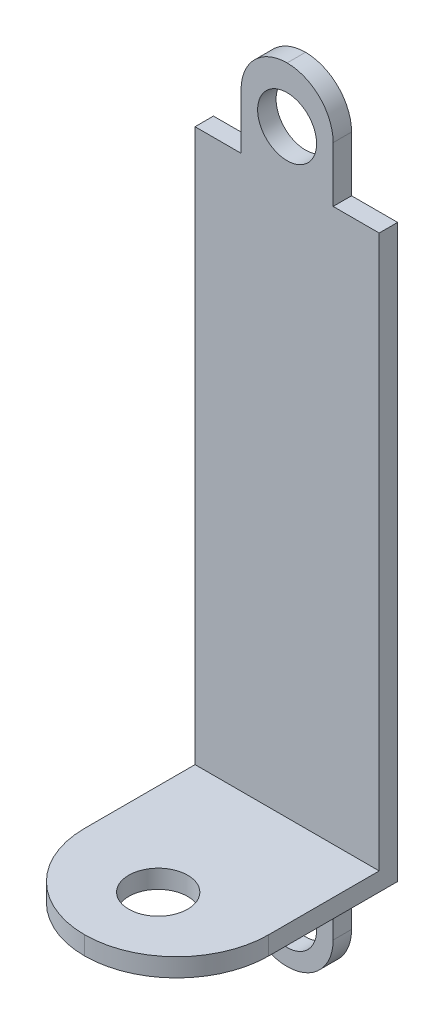
ISO-10303-21;
HEADER;
FILE_DESCRIPTION(('STEP AP214'),'2;1');
FILE_NAME('part.step','',(''),(''),'','','');
FILE_SCHEMA(('AUTOMOTIVE_DESIGN { 1 0 10303 214 1 1 1 1 }'));
ENDSEC;
DATA;
#1=APPLICATION_CONTEXT('core data for automotive mechanical design processes');
#2=APPLICATION_PROTOCOL_DEFINITION('international standard','automotive_design',2000,#1);
#3=PRODUCT_CONTEXT('',#1,'mechanical');
#4=PRODUCT('Part','Part','',(#3));
#5=PRODUCT_RELATED_PRODUCT_CATEGORY('part','',(#4));
#6=PRODUCT_DEFINITION_FORMATION('','',#4);
#7=PRODUCT_DEFINITION_CONTEXT('part definition',#1,'design');
#8=PRODUCT_DEFINITION('design','',#6,#7);
#9=PRODUCT_DEFINITION_SHAPE('','',#8);
#10=(LENGTH_UNIT() NAMED_UNIT(*) SI_UNIT(.MILLI.,.METRE.));
#11=(NAMED_UNIT(*) PLANE_ANGLE_UNIT() SI_UNIT($,.RADIAN.));
#12=(NAMED_UNIT(*) SI_UNIT($,.STERADIAN.) SOLID_ANGLE_UNIT());
#13=UNCERTAINTY_MEASURE_WITH_UNIT(LENGTH_MEASURE(1.E-05),#10,'distance_accuracy_value','');
#14=(GEOMETRIC_REPRESENTATION_CONTEXT(3) GLOBAL_UNCERTAINTY_ASSIGNED_CONTEXT((#13)) GLOBAL_UNIT_ASSIGNED_CONTEXT((#10,
#11,#12)) REPRESENTATION_CONTEXT('',''));
#15=CARTESIAN_POINT('',(0.,0.,0.));
#16=DIRECTION('',(0.,0.,1.));
#17=DIRECTION('',(1.,0.,0.));
#18=AXIS2_PLACEMENT_3D('',#15,#16,#17);
#19=CARTESIAN_POINT('',(-18.1571957093631,-29.8899270072993,12.));
#20=DIRECTION('',(0.,1.,0.));
#21=DIRECTION('',(0.,0.,1.));
#22=AXIS2_PLACEMENT_3D('',#19,#20,#21);
#23=PLANE('',#22);
#24=CARTESIAN_POINT('',(-13.1571957093631,-29.8899270072993,8.));
#25=DIRECTION('',(0.,1.,0.));
#26=DIRECTION('',(0.,0.,1.));
#27=AXIS2_PLACEMENT_3D('',#24,#25,#26);
#28=CIRCLE('',#27,1.6);
#29=CARTESIAN_POINT('',(-13.1571957093631,-29.8899270072993,9.6));
#30=VERTEX_POINT('',#29);
#31=EDGE_CURVE('E284',#30,#30,#28,.T.);
#32=ORIENTED_EDGE('',*,*,#31,.T.);
#33=EDGE_LOOP('',(#32));
#34=FACE_BOUND('',#33,.T.);
#35=DIRECTION('',(0.,0.,1.));
#36=VECTOR('',#35,1.);
#37=CARTESIAN_POINT('',(-10.6571957093631,-29.8899270072993,1.));
#38=LINE('',#37,#36);
#39=CARTESIAN_POINT('',(-10.6571957093631,-29.8899270072993,0.));
#40=VERTEX_POINT('',#39);
#41=CARTESIAN_POINT('',(-10.6571957093631,-29.8899270072993,1.));
#42=VERTEX_POINT('',#41);
#43=EDGE_CURVE('E228',#40,#42,#38,.T.);
#44=ORIENTED_EDGE('',*,*,#43,.F.);
#45=DIRECTION('',(1.,0.,0.));
#46=VECTOR('',#45,1.);
#47=CARTESIAN_POINT('',(-18.1571957093631,-29.8899270072993,0.));
#48=LINE('',#47,#46);
#49=CARTESIAN_POINT('',(-8.15719570936307,-29.8899270072993,0.));
#50=VERTEX_POINT('',#49);
#51=EDGE_CURVE('E178',#40,#50,#48,.T.);
#52=ORIENTED_EDGE('',*,*,#51,.T.);
#53=DIRECTION('',(0.,0.,-1.));
#54=VECTOR('',#53,1.);
#55=CARTESIAN_POINT('',(-8.15719570936307,-29.8899270072993,12.));
#56=LINE('',#55,#54);
#57=CARTESIAN_POINT('',(-8.15719570936307,-29.8899270072993,7.));
#58=VERTEX_POINT('',#57);
#59=EDGE_CURVE('E190',#58,#50,#56,.T.);
#60=ORIENTED_EDGE('',*,*,#59,.F.);
#61=CARTESIAN_POINT('',(-13.1571957093631,-29.8899270072993,7.));
#62=DIRECTION('',(0.,1.,0.));
#63=DIRECTION('',(0.,0.,1.));
#64=AXIS2_PLACEMENT_3D('',#61,#62,#63);
#65=CIRCLE('',#64,5.);
#66=CARTESIAN_POINT('',(-13.1571957093631,-29.8899270072993,12.));
#67=VERTEX_POINT('',#66);
#68=EDGE_CURVE('E209',#58,#67,#65,.F.);
#69=ORIENTED_EDGE('',*,*,#68,.T.);
#70=CARTESIAN_POINT('',(-13.1571957093631,-29.8899270072993,7.));
#71=DIRECTION('',(0.,1.,0.));
#72=DIRECTION('',(0.,0.,1.));
#73=AXIS2_PLACEMENT_3D('',#70,#71,#72);
#74=CIRCLE('',#73,5.);
#75=CARTESIAN_POINT('',(-18.1571957093631,-29.8899270072993,7.));
#76=VERTEX_POINT('',#75);
#77=EDGE_CURVE('E198',#67,#76,#74,.F.);
#78=ORIENTED_EDGE('',*,*,#77,.T.);
#79=DIRECTION('',(0.,0.,-1.));
#80=VECTOR('',#79,1.);
#81=CARTESIAN_POINT('',(-18.1571957093631,-29.8899270072993,12.));
#82=LINE('',#81,#80);
#83=CARTESIAN_POINT('',(-18.1571957093631,-29.8899270072993,0.));
#84=VERTEX_POINT('',#83);
#85=EDGE_CURVE('E193',#76,#84,#82,.T.);
#86=ORIENTED_EDGE('',*,*,#85,.T.);
#87=CARTESIAN_POINT('',(-15.6571957093631,-29.8899270072993,0.));
#88=VERTEX_POINT('',#87);
#89=EDGE_CURVE('E177',#84,#88,#48,.T.);
#90=ORIENTED_EDGE('',*,*,#89,.T.);
#91=DIRECTION('',(0.,0.,-1.));
#92=VECTOR('',#91,1.);
#93=CARTESIAN_POINT('',(-15.6571957093631,-29.8899270072993,1.));
#94=LINE('',#93,#92);
#95=CARTESIAN_POINT('',(-15.6571957093631,-29.8899270072993,1.));
#96=VERTEX_POINT('',#95);
#97=EDGE_CURVE('E270',#96,#88,#94,.T.);
#98=ORIENTED_EDGE('',*,*,#97,.F.);
#99=DIRECTION('',(-1.,0.,0.));
#100=VECTOR('',#99,1.);
#101=CARTESIAN_POINT('',(-15.6571957093631,-29.8899270072993,1.));
#102=LINE('',#101,#100);
#103=EDGE_CURVE('E267',#42,#96,#102,.T.);
#104=ORIENTED_EDGE('',*,*,#103,.F.);
#105=EDGE_LOOP('',(#44,#52,#60,#69,#78,#86,#90,#98,#104));
#106=FACE_BOUND('',#105,.T.);
#107=ADVANCED_FACE('F33',(#34,#106),#23,.F.);
#108=CARTESIAN_POINT('',(-18.1571957093631,6.61007299270073,12.));
#109=DIRECTION('',(1.,0.,0.));
#110=DIRECTION('',(0.,0.,-1.));
#111=AXIS2_PLACEMENT_3D('',#108,#109,#110);
#112=PLANE('',#111);
#113=DIRECTION('',(0.,1.,0.));
#114=VECTOR('',#113,1.);
#115=CARTESIAN_POINT('',(-18.1571957093631,0.,1.));
#116=LINE('',#115,#114);
#117=CARTESIAN_POINT('',(-18.1571957093631,-28.8899270072993,1.));
#118=VERTEX_POINT('',#117);
#119=CARTESIAN_POINT('',(-18.1571957093631,1.11007299270073,1.));
#120=VERTEX_POINT('',#119);
#121=EDGE_CURVE('E170',#118,#120,#116,.T.);
#122=ORIENTED_EDGE('',*,*,#121,.T.);
#123=DIRECTION('',(0.,0.,-1.));
#124=VECTOR('',#123,1.);
#125=CARTESIAN_POINT('',(-18.1571957093631,1.11007299270073,7.04152298679729));
#126=LINE('',#125,#124);
#127=CARTESIAN_POINT('',(-18.1571957093631,1.11007299270073,0.));
#128=VERTEX_POINT('',#127);
#129=EDGE_CURVE('E153',#120,#128,#126,.T.);
#130=ORIENTED_EDGE('',*,*,#129,.T.);
#131=DIRECTION('',(0.,-1.,0.));
#132=VECTOR('',#131,1.);
#133=CARTESIAN_POINT('',(-18.1571957093631,6.61007299270073,0.));
#134=LINE('',#133,#132);
#135=EDGE_CURVE('E167',#128,#84,#134,.T.);
#136=ORIENTED_EDGE('',*,*,#135,.T.);
#137=ORIENTED_EDGE('',*,*,#85,.F.);
#138=DIRECTION('',(0.,-1.,0.));
#139=VECTOR('',#138,1.);
#140=CARTESIAN_POINT('',(-18.1571957093631,-28.8899270072993,7.));
#141=LINE('',#140,#139);
#142=CARTESIAN_POINT('',(-18.1571957093631,-28.8899270072993,7.));
#143=VERTEX_POINT('',#142);
#144=EDGE_CURVE('E200',#76,#143,#141,.F.);
#145=ORIENTED_EDGE('',*,*,#144,.T.);
#146=DIRECTION('',(0.,0.,-1.));
#147=VECTOR('',#146,1.);
#148=CARTESIAN_POINT('',(-18.1571957093631,-28.8899270072993,0.));
#149=LINE('',#148,#147);
#150=EDGE_CURVE('E293',#143,#118,#149,.T.);
#151=ORIENTED_EDGE('',*,*,#150,.T.);
#152=EDGE_LOOP('',(#122,#130,#136,#137,#145,#151));
#153=FACE_BOUND('',#152,.T.);
#154=ADVANCED_FACE('F165',(#153),#112,.F.);
#155=CARTESIAN_POINT('',(-8.15719570936307,6.61007299270073,12.));
#156=DIRECTION('',(-1.,0.,0.));
#157=DIRECTION('',(0.,-1.,0.));
#158=AXIS2_PLACEMENT_3D('',#155,#156,#157);
#159=PLANE('',#158);
#160=DIRECTION('',(0.,1.,0.));
#161=VECTOR('',#160,1.);
#162=CARTESIAN_POINT('',(-8.15719570936307,6.61007299270073,0.));
#163=LINE('',#162,#161);
#164=CARTESIAN_POINT('',(-8.15719570936307,1.11007299270073,0.));
#165=VERTEX_POINT('',#164);
#166=EDGE_CURVE('E187',#50,#165,#163,.T.);
#167=ORIENTED_EDGE('',*,*,#166,.T.);
#168=DIRECTION('',(0.,0.,-1.));
#169=VECTOR('',#168,1.);
#170=CARTESIAN_POINT('',(-8.15719570936307,1.11007299270073,7.04152298679729));
#171=LINE('',#170,#169);
#172=CARTESIAN_POINT('',(-8.15719570936307,1.11007299270073,1.));
#173=VERTEX_POINT('',#172);
#174=EDGE_CURVE('E252',#173,#165,#171,.T.);
#175=ORIENTED_EDGE('',*,*,#174,.F.);
#176=DIRECTION('',(0.,1.,0.));
#177=VECTOR('',#176,1.);
#178=CARTESIAN_POINT('',(-8.15719570936307,0.,1.));
#179=LINE('',#178,#177);
#180=CARTESIAN_POINT('',(-8.15719570936307,-28.8899270072993,1.));
#181=VERTEX_POINT('',#180);
#182=EDGE_CURVE('E183',#181,#173,#179,.T.);
#183=ORIENTED_EDGE('',*,*,#182,.F.);
#184=DIRECTION('',(0.,0.,-1.));
#185=VECTOR('',#184,1.);
#186=CARTESIAN_POINT('',(-8.15719570936307,-28.8899270072993,0.));
#187=LINE('',#186,#185);
#188=CARTESIAN_POINT('',(-8.15719570936307,-28.8899270072993,7.));
#189=VERTEX_POINT('',#188);
#190=EDGE_CURVE('E294',#189,#181,#187,.T.);
#191=ORIENTED_EDGE('',*,*,#190,.F.);
#192=DIRECTION('',(0.,1.,0.));
#193=VECTOR('',#192,1.);
#194=CARTESIAN_POINT('',(-8.15719570936307,-29.8899270072993,7.));
#195=LINE('',#194,#193);
#196=EDGE_CURVE('E207',#189,#58,#195,.F.);
#197=ORIENTED_EDGE('',*,*,#196,.T.);
#198=ORIENTED_EDGE('',*,*,#59,.T.);
#199=EDGE_LOOP('',(#167,#175,#183,#191,#197,#198));
#200=FACE_BOUND('',#199,.T.);
#201=ADVANCED_FACE('F307',(#200),#159,.F.);
#202=CARTESIAN_POINT('',(0.,0.,0.));
#203=DIRECTION('',(0.,0.,1.));
#204=DIRECTION('',(1.,0.,0.));
#205=AXIS2_PLACEMENT_3D('',#202,#203,#204);
#206=PLANE('',#205);
#207=CARTESIAN_POINT('',(-13.1571957093631,-33.3899270072993,0.));
#208=DIRECTION('',(0.,0.,1.));
#209=DIRECTION('',(1.,0.,0.));
#210=AXIS2_PLACEMENT_3D('',#207,#208,#209);
#211=CIRCLE('',#210,1.6);
#212=CARTESIAN_POINT('',(-11.5571957093631,-33.3899270072993,0.));
#213=VERTEX_POINT('',#212);
#214=EDGE_CURVE('E229',#213,#213,#211,.F.);
#215=ORIENTED_EDGE('',*,*,#214,.F.);
#216=EDGE_LOOP('',(#215));
#217=FACE_BOUND('',#216,.T.);
#218=CARTESIAN_POINT('',(-13.1571957093631,3.61007299270073,0.));
#219=DIRECTION('',(0.,0.,1.));
#220=DIRECTION('',(1.,0.,0.));
#221=AXIS2_PLACEMENT_3D('',#218,#219,#220);
#222=CIRCLE('',#221,1.6);
#223=CARTESIAN_POINT('',(-11.5571957093631,3.61007299270073,0.));
#224=VERTEX_POINT('',#223);
#225=EDGE_CURVE('E290',#224,#224,#222,.T.);
#226=ORIENTED_EDGE('',*,*,#225,.T.);
#227=EDGE_LOOP('',(#226));
#228=FACE_BOUND('',#227,.T.);
#229=CARTESIAN_POINT('',(-13.1571957093631,4.11007299270073,0.));
#230=DIRECTION('',(0.,0.,1.));
#231=DIRECTION('',(1.,0.,0.));
#232=AXIS2_PLACEMENT_3D('',#229,#230,#231);
#233=CIRCLE('',#232,2.5);
#234=CARTESIAN_POINT('',(-15.6571957093631,4.11007299270073,0.));
#235=VERTEX_POINT('',#234);
#236=CARTESIAN_POINT('',(-13.1571957093631,6.61007299270073,0.));
#237=VERTEX_POINT('',#236);
#238=EDGE_CURVE('E224',#235,#237,#233,.F.);
#239=ORIENTED_EDGE('',*,*,#238,.T.);
#240=CARTESIAN_POINT('',(-13.1571957093631,4.11007299270073,0.));
#241=DIRECTION('',(0.,0.,1.));
#242=DIRECTION('',(1.,0.,0.));
#243=AXIS2_PLACEMENT_3D('',#240,#241,#242);
#244=CIRCLE('',#243,2.5);
#245=CARTESIAN_POINT('',(-10.6571957093631,4.11007299270073,0.));
#246=VERTEX_POINT('',#245);
#247=EDGE_CURVE('E231',#237,#246,#244,.F.);
#248=ORIENTED_EDGE('',*,*,#247,.T.);
#249=DIRECTION('',(0.,1.,0.));
#250=VECTOR('',#249,1.);
#251=CARTESIAN_POINT('',(-10.6571957093631,6.61007299270073,0.));
#252=LINE('',#251,#250);
#253=CARTESIAN_POINT('',(-10.6571957093631,1.11007299270073,0.));
#254=VERTEX_POINT('',#253);
#255=EDGE_CURVE('E244',#254,#246,#252,.T.);
#256=ORIENTED_EDGE('',*,*,#255,.F.);
#257=DIRECTION('',(-1.,0.,0.));
#258=VECTOR('',#257,1.);
#259=CARTESIAN_POINT('',(-8.15719570936307,1.11007299270073,0.));
#260=LINE('',#259,#258);
#261=EDGE_CURVE('E171',#165,#254,#260,.T.);
#262=ORIENTED_EDGE('',*,*,#261,.F.);
#263=ORIENTED_EDGE('',*,*,#166,.F.);
#264=ORIENTED_EDGE('',*,*,#51,.F.);
#265=DIRECTION('',(0.,1.,0.));
#266=VECTOR('',#265,1.);
#267=CARTESIAN_POINT('',(-10.6571957093631,-35.8899270072993,0.));
#268=LINE('',#267,#266);
#269=CARTESIAN_POINT('',(-10.6571957093631,-33.3899270072993,0.));
#270=VERTEX_POINT('',#269);
#271=EDGE_CURVE('E273',#270,#40,#268,.T.);
#272=ORIENTED_EDGE('',*,*,#271,.F.);
#273=CARTESIAN_POINT('',(-13.1571957093631,-33.3899270072993,0.));
#274=DIRECTION('',(0.,0.,1.));
#275=DIRECTION('',(1.,0.,0.));
#276=AXIS2_PLACEMENT_3D('',#273,#274,#275);
#277=CIRCLE('',#276,2.5);
#278=CARTESIAN_POINT('',(-13.1571957093631,-35.8899270072993,0.));
#279=VERTEX_POINT('',#278);
#280=EDGE_CURVE('E211',#270,#279,#277,.F.);
#281=ORIENTED_EDGE('',*,*,#280,.T.);
#282=CARTESIAN_POINT('',(-13.1571957093631,-33.3899270072993,0.));
#283=DIRECTION('',(0.,0.,1.));
#284=DIRECTION('',(1.,0.,0.));
#285=AXIS2_PLACEMENT_3D('',#282,#283,#284);
#286=CIRCLE('',#285,2.5);
#287=CARTESIAN_POINT('',(-15.6571957093631,-33.3899270072993,0.));
#288=VERTEX_POINT('',#287);
#289=EDGE_CURVE('E213',#279,#288,#286,.F.);
#290=ORIENTED_EDGE('',*,*,#289,.T.);
#291=DIRECTION('',(0.,1.,0.));
#292=VECTOR('',#291,1.);
#293=CARTESIAN_POINT('',(-15.6571957093631,-35.8899270072993,0.));
#294=LINE('',#293,#292);
#295=EDGE_CURVE('E275',#288,#88,#294,.T.);
#296=ORIENTED_EDGE('',*,*,#295,.T.);
#297=ORIENTED_EDGE('',*,*,#89,.F.);
#298=ORIENTED_EDGE('',*,*,#135,.F.);
#299=DIRECTION('',(-1.,0.,0.));
#300=VECTOR('',#299,1.);
#301=CARTESIAN_POINT('',(-18.1571957093631,1.11007299270073,0.));
#302=LINE('',#301,#300);
#303=CARTESIAN_POINT('',(-15.6571957093631,1.11007299270073,0.));
#304=VERTEX_POINT('',#303);
#305=EDGE_CURVE('E149',#304,#128,#302,.T.);
#306=ORIENTED_EDGE('',*,*,#305,.F.);
#307=DIRECTION('',(0.,-1.,0.));
#308=VECTOR('',#307,1.);
#309=CARTESIAN_POINT('',(-15.6571957093631,6.61007299270073,0.));
#310=LINE('',#309,#308);
#311=EDGE_CURVE('E161',#235,#304,#310,.T.);
#312=ORIENTED_EDGE('',*,*,#311,.F.);
#313=EDGE_LOOP('',(#239,#248,#256,#262,#263,#264,#272,#281,#290,#296,#297,#298,#306,#312));
#314=FACE_BOUND('',#313,.T.);
#315=ADVANCED_FACE('F175',(#217,#228,#314),#206,.F.);
#316=CARTESIAN_POINT('',(-8.15719570936307,-28.8899270072993,0.));
#317=DIRECTION('',(0.,1.,0.));
#318=DIRECTION('',(0.,0.,1.));
#319=AXIS2_PLACEMENT_3D('',#316,#317,#318);
#320=PLANE('',#319);
#321=CARTESIAN_POINT('',(-13.1571957093631,-28.8899270072993,8.));
#322=DIRECTION('',(0.,1.,0.));
#323=DIRECTION('',(0.,0.,1.));
#324=AXIS2_PLACEMENT_3D('',#321,#322,#323);
#325=CIRCLE('',#324,1.6);
#326=CARTESIAN_POINT('',(-13.1571957093631,-28.8899270072993,9.6));
#327=VERTEX_POINT('',#326);
#328=EDGE_CURVE('E281',#327,#327,#325,.T.);
#329=ORIENTED_EDGE('',*,*,#328,.F.);
#330=EDGE_LOOP('',(#329));
#331=FACE_BOUND('',#330,.T.);
#332=CARTESIAN_POINT('',(-13.1571957093631,-28.8899270072993,7.));
#333=DIRECTION('',(0.,1.,0.));
#334=DIRECTION('',(0.,0.,1.));
#335=AXIS2_PLACEMENT_3D('',#332,#333,#334);
#336=CIRCLE('',#335,5.);
#337=CARTESIAN_POINT('',(-13.1571957093631,-28.8899270072993,12.));
#338=VERTEX_POINT('',#337);
#339=EDGE_CURVE('E202',#143,#338,#336,.T.);
#340=ORIENTED_EDGE('',*,*,#339,.T.);
#341=CARTESIAN_POINT('',(-13.1571957093631,-28.8899270072993,7.));
#342=DIRECTION('',(0.,1.,0.));
#343=DIRECTION('',(0.,0.,1.));
#344=AXIS2_PLACEMENT_3D('',#341,#342,#343);
#345=CIRCLE('',#344,5.);
#346=EDGE_CURVE('E205',#338,#189,#345,.T.);
#347=ORIENTED_EDGE('',*,*,#346,.T.);
#348=ORIENTED_EDGE('',*,*,#190,.T.);
#349=DIRECTION('',(-1.,0.,0.));
#350=VECTOR('',#349,1.);
#351=CARTESIAN_POINT('',(-8.15719570936307,-28.8899270072993,1.));
#352=LINE('',#351,#350);
#353=EDGE_CURVE('E179',#181,#118,#352,.T.);
#354=ORIENTED_EDGE('',*,*,#353,.T.);
#355=ORIENTED_EDGE('',*,*,#150,.F.);
#356=EDGE_LOOP('',(#340,#347,#348,#354,#355));
#357=FACE_BOUND('',#356,.T.);
#358=ADVANCED_FACE('F303',(#331,#357),#320,.T.);
#359=CARTESIAN_POINT('',(-8.15719570936307,0.,1.));
#360=DIRECTION('',(0.,0.,1.));
#361=DIRECTION('',(1.,0.,0.));
#362=AXIS2_PLACEMENT_3D('',#359,#360,#361);
#363=PLANE('',#362);
#364=DIRECTION('',(0.,1.,0.));
#365=VECTOR('',#364,1.);
#366=CARTESIAN_POINT('',(-10.6571957093631,6.61007299270073,1.));
#367=LINE('',#366,#365);
#368=CARTESIAN_POINT('',(-10.6571957093631,1.11007299270073,1.));
#369=VERTEX_POINT('',#368);
#370=CARTESIAN_POINT('',(-10.6571957093631,4.11007299270073,1.));
#371=VERTEX_POINT('',#370);
#372=EDGE_CURVE('E241',#369,#371,#367,.T.);
#373=ORIENTED_EDGE('',*,*,#372,.T.);
#374=CARTESIAN_POINT('',(-13.1571957093631,4.11007299270073,1.));
#375=DIRECTION('',(0.,0.,1.));
#376=DIRECTION('',(1.,0.,0.));
#377=AXIS2_PLACEMENT_3D('',#374,#375,#376);
#378=CIRCLE('',#377,2.5);
#379=CARTESIAN_POINT('',(-13.1571957093631,6.61007299270073,1.));
#380=VERTEX_POINT('',#379);
#381=EDGE_CURVE('E42',#371,#380,#378,.T.);
#382=ORIENTED_EDGE('',*,*,#381,.T.);
#383=CARTESIAN_POINT('',(-13.1571957093631,4.11007299270073,1.));
#384=DIRECTION('',(0.,0.,1.));
#385=DIRECTION('',(1.,0.,0.));
#386=AXIS2_PLACEMENT_3D('',#383,#384,#385);
#387=CIRCLE('',#386,2.5);
#388=CARTESIAN_POINT('',(-15.6571957093631,4.11007299270073,1.));
#389=VERTEX_POINT('',#388);
#390=EDGE_CURVE('E52',#380,#389,#387,.T.);
#391=ORIENTED_EDGE('',*,*,#390,.T.);
#392=DIRECTION('',(0.,-1.,0.));
#393=VECTOR('',#392,1.);
#394=CARTESIAN_POINT('',(-15.6571957093631,6.61007299270073,1.));
#395=LINE('',#394,#393);
#396=CARTESIAN_POINT('',(-15.6571957093631,1.11007299270073,1.));
#397=VERTEX_POINT('',#396);
#398=EDGE_CURVE('E160',#389,#397,#395,.T.);
#399=ORIENTED_EDGE('',*,*,#398,.T.);
#400=DIRECTION('',(-1.,0.,0.));
#401=VECTOR('',#400,1.);
#402=CARTESIAN_POINT('',(-18.1571957093631,1.11007299270073,1.));
#403=LINE('',#402,#401);
#404=EDGE_CURVE('E172',#397,#120,#403,.T.);
#405=ORIENTED_EDGE('',*,*,#404,.T.);
#406=ORIENTED_EDGE('',*,*,#121,.F.);
#407=ORIENTED_EDGE('',*,*,#353,.F.);
#408=ORIENTED_EDGE('',*,*,#182,.T.);
#409=DIRECTION('',(-1.,0.,0.));
#410=VECTOR('',#409,1.);
#411=CARTESIAN_POINT('',(-8.15719570936307,1.11007299270073,1.));
#412=LINE('',#411,#410);
#413=EDGE_CURVE('E251',#173,#369,#412,.T.);
#414=ORIENTED_EDGE('',*,*,#413,.T.);
#415=EDGE_LOOP('',(#373,#382,#391,#399,#405,#406,#407,#408,#414));
#416=FACE_BOUND('',#415,.T.);
#417=CARTESIAN_POINT('',(-13.1571957093631,3.61007299270073,1.));
#418=DIRECTION('',(0.,0.,1.));
#419=DIRECTION('',(1.,0.,0.));
#420=AXIS2_PLACEMENT_3D('',#417,#418,#419);
#421=CIRCLE('',#420,1.6);
#422=CARTESIAN_POINT('',(-11.5571957093631,3.61007299270073,1.));
#423=VERTEX_POINT('',#422);
#424=EDGE_CURVE('E287',#423,#423,#421,.T.);
#425=ORIENTED_EDGE('',*,*,#424,.F.);
#426=EDGE_LOOP('',(#425));
#427=FACE_BOUND('',#426,.T.);
#428=ADVANCED_FACE('F248',(#416,#427),#363,.T.);
#429=CARTESIAN_POINT('',(-13.1571957093631,3.61007299270073,-15.77));
#430=DIRECTION('',(0.,0.,1.));
#431=DIRECTION('',(1.,0.,0.));
#432=AXIS2_PLACEMENT_3D('',#429,#430,#431);
#433=CYLINDRICAL_SURFACE('',#432,1.6);
#434=ORIENTED_EDGE('',*,*,#424,.T.);
#435=EDGE_LOOP('',(#434));
#436=FACE_BOUND('',#435,.T.);
#437=ORIENTED_EDGE('',*,*,#225,.F.);
#438=EDGE_LOOP('',(#437));
#439=FACE_BOUND('',#438,.T.);
#440=ADVANCED_FACE('F328',(#436,#439),#433,.F.);
#441=CARTESIAN_POINT('',(-13.1571957093631,-45.6599270072993,8.));
#442=DIRECTION('',(0.,1.,0.));
#443=DIRECTION('',(0.,0.,1.));
#444=AXIS2_PLACEMENT_3D('',#441,#442,#443);
#445=CYLINDRICAL_SURFACE('',#444,1.6);
#446=ORIENTED_EDGE('',*,*,#328,.T.);
#447=EDGE_LOOP('',(#446));
#448=FACE_BOUND('',#447,.T.);
#449=ORIENTED_EDGE('',*,*,#31,.F.);
#450=EDGE_LOOP('',(#449));
#451=FACE_BOUND('',#450,.T.);
#452=ADVANCED_FACE('F320',(#448,#451),#445,.F.);
#453=CARTESIAN_POINT('',(-13.1571957093631,0.,7.));
#454=DIRECTION('',(0.,1.,0.));
#455=DIRECTION('',(0.,0.,1.));
#456=AXIS2_PLACEMENT_3D('',#453,#454,#455);
#457=CYLINDRICAL_SURFACE('',#456,5.);
#458=ORIENTED_EDGE('',*,*,#339,.F.);
#459=ORIENTED_EDGE('',*,*,#144,.F.);
#460=ORIENTED_EDGE('',*,*,#77,.F.);
#461=DIRECTION('',(0.,-1.,0.));
#462=VECTOR('',#461,1.);
#463=CARTESIAN_POINT('',(-13.1571957093631,-29.8899270072993,12.));
#464=LINE('',#463,#462);
#465=EDGE_CURVE('E195',#338,#67,#464,.T.);
#466=ORIENTED_EDGE('',*,*,#465,.F.);
#467=EDGE_LOOP('',(#458,#459,#460,#466));
#468=FACE_BOUND('',#467,.T.);
#469=ADVANCED_FACE('F318',(#468),#457,.T.);
#470=CARTESIAN_POINT('',(-13.1571957093631,0.,7.));
#471=DIRECTION('',(0.,-1.,0.));
#472=DIRECTION('',(1.,0.,0.));
#473=AXIS2_PLACEMENT_3D('',#470,#471,#472);
#474=CYLINDRICAL_SURFACE('',#473,5.);
#475=ORIENTED_EDGE('',*,*,#68,.F.);
#476=ORIENTED_EDGE('',*,*,#196,.F.);
#477=ORIENTED_EDGE('',*,*,#346,.F.);
#478=ORIENTED_EDGE('',*,*,#465,.T.);
#479=EDGE_LOOP('',(#475,#476,#477,#478));
#480=FACE_BOUND('',#479,.T.);
#481=ADVANCED_FACE('F312',(#480),#474,.T.);
#482=CARTESIAN_POINT('',(-10.6571957093631,-35.8899270072993,1.));
#483=DIRECTION('',(-1.,0.,0.));
#484=DIRECTION('',(0.,0.,1.));
#485=AXIS2_PLACEMENT_3D('',#482,#483,#484);
#486=PLANE('',#485);
#487=DIRECTION('',(0.,1.,0.));
#488=VECTOR('',#487,1.);
#489=CARTESIAN_POINT('',(-10.6571957093631,-35.8899270072993,1.));
#490=LINE('',#489,#488);
#491=CARTESIAN_POINT('',(-10.6571957093631,-33.3899270072993,1.));
#492=VERTEX_POINT('',#491);
#493=EDGE_CURVE('E279',#492,#42,#490,.T.);
#494=ORIENTED_EDGE('',*,*,#493,.F.);
#495=DIRECTION('',(0.,0.,1.));
#496=VECTOR('',#495,1.);
#497=CARTESIAN_POINT('',(-10.6571957093631,-33.3899270072993,0.));
#498=LINE('',#497,#496);
#499=EDGE_CURVE('E222',#492,#270,#498,.F.);
#500=ORIENTED_EDGE('',*,*,#499,.T.);
#501=ORIENTED_EDGE('',*,*,#271,.T.);
#502=ORIENTED_EDGE('',*,*,#43,.T.);
#503=EDGE_LOOP('',(#494,#500,#501,#502));
#504=FACE_BOUND('',#503,.T.);
#505=ADVANCED_FACE('F326',(#504),#486,.F.);
#506=CARTESIAN_POINT('',(-15.6571957093631,-35.8899270072993,1.));
#507=DIRECTION('',(0.,0.,-1.));
#508=DIRECTION('',(-1.,0.,0.));
#509=AXIS2_PLACEMENT_3D('',#506,#507,#508);
#510=PLANE('',#509);
#511=CARTESIAN_POINT('',(-13.1571957093631,-33.3899270072993,1.));
#512=DIRECTION('',(0.,0.,1.));
#513=DIRECTION('',(1.,0.,0.));
#514=AXIS2_PLACEMENT_3D('',#511,#512,#513);
#515=CIRCLE('',#514,1.6);
#516=CARTESIAN_POINT('',(-11.5571957093631,-33.3899270072993,1.));
#517=VERTEX_POINT('',#516);
#518=EDGE_CURVE('E255',#517,#517,#515,.T.);
#519=ORIENTED_EDGE('',*,*,#518,.F.);
#520=EDGE_LOOP('',(#519));
#521=FACE_BOUND('',#520,.T.);
#522=DIRECTION('',(0.,1.,0.));
#523=VECTOR('',#522,1.);
#524=CARTESIAN_POINT('',(-15.6571957093631,-35.8899270072993,1.));
#525=LINE('',#524,#523);
#526=CARTESIAN_POINT('',(-15.6571957093631,-33.3899270072993,1.));
#527=VERTEX_POINT('',#526);
#528=EDGE_CURVE('E277',#527,#96,#525,.T.);
#529=ORIENTED_EDGE('',*,*,#528,.F.);
#530=CARTESIAN_POINT('',(-13.1571957093631,-33.3899270072993,1.));
#531=DIRECTION('',(0.,0.,-1.));
#532=DIRECTION('',(-1.,0.,0.));
#533=AXIS2_PLACEMENT_3D('',#530,#531,#532);
#534=CIRCLE('',#533,2.5);
#535=CARTESIAN_POINT('',(-13.1571957093631,-35.8899270072993,1.));
#536=VERTEX_POINT('',#535);
#537=EDGE_CURVE('E220',#527,#536,#534,.F.);
#538=ORIENTED_EDGE('',*,*,#537,.T.);
#539=CARTESIAN_POINT('',(-13.1571957093631,-33.3899270072993,1.));
#540=DIRECTION('',(0.,0.,-1.));
#541=DIRECTION('',(-1.,0.,0.));
#542=AXIS2_PLACEMENT_3D('',#539,#540,#541);
#543=CIRCLE('',#542,2.5);
#544=EDGE_CURVE('E218',#536,#492,#543,.F.);
#545=ORIENTED_EDGE('',*,*,#544,.T.);
#546=ORIENTED_EDGE('',*,*,#493,.T.);
#547=ORIENTED_EDGE('',*,*,#103,.T.);
#548=EDGE_LOOP('',(#529,#538,#545,#546,#547));
#549=FACE_BOUND('',#548,.T.);
#550=ADVANCED_FACE('F354',(#521,#549),#510,.F.);
#551=CARTESIAN_POINT('',(-15.6571957093631,-35.8899270072993,1.));
#552=DIRECTION('',(1.,0.,0.));
#553=DIRECTION('',(0.,0.,-1.));
#554=AXIS2_PLACEMENT_3D('',#551,#552,#553);
#555=PLANE('',#554);
#556=ORIENTED_EDGE('',*,*,#295,.F.);
#557=DIRECTION('',(0.,0.,-1.));
#558=VECTOR('',#557,1.);
#559=CARTESIAN_POINT('',(-15.6571957093631,-33.3899270072993,1.));
#560=LINE('',#559,#558);
#561=EDGE_CURVE('E215',#288,#527,#560,.F.);
#562=ORIENTED_EDGE('',*,*,#561,.T.);
#563=ORIENTED_EDGE('',*,*,#528,.T.);
#564=ORIENTED_EDGE('',*,*,#97,.T.);
#565=EDGE_LOOP('',(#556,#562,#563,#564));
#566=FACE_BOUND('',#565,.T.);
#567=ADVANCED_FACE('F358',(#566),#555,.F.);
#568=CARTESIAN_POINT('',(-13.1571957093631,-33.3899270072993,0.));
#569=DIRECTION('',(0.,0.,-1.));
#570=DIRECTION('',(-1.,0.,0.));
#571=AXIS2_PLACEMENT_3D('',#568,#569,#570);
#572=CYLINDRICAL_SURFACE('',#571,2.5);
#573=ORIENTED_EDGE('',*,*,#499,.F.);
#574=ORIENTED_EDGE('',*,*,#544,.F.);
#575=DIRECTION('',(0.,0.,1.));
#576=VECTOR('',#575,1.);
#577=CARTESIAN_POINT('',(-13.1571957093631,-35.8899270072993,1.));
#578=LINE('',#577,#576);
#579=EDGE_CURVE('E225',#279,#536,#578,.T.);
#580=ORIENTED_EDGE('',*,*,#579,.F.);
#581=ORIENTED_EDGE('',*,*,#280,.F.);
#582=EDGE_LOOP('',(#573,#574,#580,#581));
#583=FACE_BOUND('',#582,.T.);
#584=ADVANCED_FACE('F362',(#583),#572,.T.);
#585=CARTESIAN_POINT('',(-13.1571957093631,-33.3899270072993,0.));
#586=DIRECTION('',(0.,0.,1.));
#587=DIRECTION('',(1.,0.,0.));
#588=AXIS2_PLACEMENT_3D('',#585,#586,#587);
#589=CYLINDRICAL_SURFACE('',#588,2.5);
#590=ORIENTED_EDGE('',*,*,#537,.F.);
#591=ORIENTED_EDGE('',*,*,#561,.F.);
#592=ORIENTED_EDGE('',*,*,#289,.F.);
#593=ORIENTED_EDGE('',*,*,#579,.T.);
#594=EDGE_LOOP('',(#590,#591,#592,#593));
#595=FACE_BOUND('',#594,.T.);
#596=ADVANCED_FACE('F368',(#595),#589,.T.);
#597=CARTESIAN_POINT('',(-13.1571957093631,-33.3899270072993,-4.52548339959389));
#598=DIRECTION('',(0.,0.,1.));
#599=DIRECTION('',(1.,0.,0.));
#600=AXIS2_PLACEMENT_3D('',#597,#598,#599);
#601=CYLINDRICAL_SURFACE('',#600,1.6);
#602=ORIENTED_EDGE('',*,*,#214,.T.);
#603=EDGE_LOOP('',(#602));
#604=FACE_BOUND('',#603,.T.);
#605=ORIENTED_EDGE('',*,*,#518,.T.);
#606=EDGE_LOOP('',(#605));
#607=FACE_BOUND('',#606,.T.);
#608=ADVANCED_FACE('F364',(#604,#607),#601,.F.);
#609=CARTESIAN_POINT('',(-8.15719570936307,1.11007299270073,7.04152298679729));
#610=DIRECTION('',(0.,-1.,0.));
#611=DIRECTION('',(0.,0.,-1.));
#612=AXIS2_PLACEMENT_3D('',#609,#610,#611);
#613=PLANE('',#612);
#614=ORIENTED_EDGE('',*,*,#174,.T.);
#615=ORIENTED_EDGE('',*,*,#261,.T.);
#616=DIRECTION('',(0.,0.,-1.));
#617=VECTOR('',#616,1.);
#618=CARTESIAN_POINT('',(-10.6571957093631,1.11007299270073,7.04152298679729));
#619=LINE('',#618,#617);
#620=EDGE_CURVE('E253',#369,#254,#619,.T.);
#621=ORIENTED_EDGE('',*,*,#620,.F.);
#622=ORIENTED_EDGE('',*,*,#413,.F.);
#623=EDGE_LOOP('',(#614,#615,#621,#622));
#624=FACE_BOUND('',#623,.T.);
#625=ADVANCED_FACE('F367',(#624),#613,.F.);
#626=CARTESIAN_POINT('',(-10.6571957093631,6.61007299270073,7.04152298679729));
#627=DIRECTION('',(-1.,0.,0.));
#628=DIRECTION('',(0.,-1.,0.));
#629=AXIS2_PLACEMENT_3D('',#626,#627,#628);
#630=PLANE('',#629);
#631=ORIENTED_EDGE('',*,*,#255,.T.);
#632=DIRECTION('',(0.,0.,-1.));
#633=VECTOR('',#632,1.);
#634=CARTESIAN_POINT('',(-10.6571957093631,4.11007299270073,7.04152298679729));
#635=LINE('',#634,#633);
#636=EDGE_CURVE('E233',#246,#371,#635,.F.);
#637=ORIENTED_EDGE('',*,*,#636,.T.);
#638=ORIENTED_EDGE('',*,*,#372,.F.);
#639=ORIENTED_EDGE('',*,*,#620,.T.);
#640=EDGE_LOOP('',(#631,#637,#638,#639));
#641=FACE_BOUND('',#640,.T.);
#642=ADVANCED_FACE('F240',(#641),#630,.F.);
#643=CARTESIAN_POINT('',(-15.6571957093631,6.61007299270073,7.04152298679729));
#644=DIRECTION('',(1.,0.,0.));
#645=DIRECTION('',(0.,0.,-1.));
#646=AXIS2_PLACEMENT_3D('',#643,#644,#645);
#647=PLANE('',#646);
#648=ORIENTED_EDGE('',*,*,#398,.F.);
#649=DIRECTION('',(0.,0.,-1.));
#650=VECTOR('',#649,1.);
#651=CARTESIAN_POINT('',(-15.6571957093631,4.11007299270073,7.04152298679729));
#652=LINE('',#651,#650);
#653=EDGE_CURVE('E11',#389,#235,#652,.T.);
#654=ORIENTED_EDGE('',*,*,#653,.T.);
#655=ORIENTED_EDGE('',*,*,#311,.T.);
#656=DIRECTION('',(0.,0.,-1.));
#657=VECTOR('',#656,1.);
#658=CARTESIAN_POINT('',(-15.6571957093631,1.11007299270073,7.04152298679729));
#659=LINE('',#658,#657);
#660=EDGE_CURVE('E156',#397,#304,#659,.T.);
#661=ORIENTED_EDGE('',*,*,#660,.F.);
#662=EDGE_LOOP('',(#648,#654,#655,#661));
#663=FACE_BOUND('',#662,.T.);
#664=ADVANCED_FACE('F375',(#663),#647,.F.);
#665=CARTESIAN_POINT('',(-18.1571957093631,1.11007299270073,7.04152298679729));
#666=DIRECTION('',(0.,-1.,0.));
#667=DIRECTION('',(0.,0.,-1.));
#668=AXIS2_PLACEMENT_3D('',#665,#666,#667);
#669=PLANE('',#668);
#670=ORIENTED_EDGE('',*,*,#660,.T.);
#671=ORIENTED_EDGE('',*,*,#305,.T.);
#672=ORIENTED_EDGE('',*,*,#129,.F.);
#673=ORIENTED_EDGE('',*,*,#404,.F.);
#674=EDGE_LOOP('',(#670,#671,#672,#673));
#675=FACE_BOUND('',#674,.T.);
#676=ADVANCED_FACE('F151',(#675),#669,.F.);
#677=CARTESIAN_POINT('',(-13.1571957093631,4.11007299270073,7.04152298679729));
#678=DIRECTION('',(0.,0.,-1.));
#679=DIRECTION('',(-1.,0.,0.));
#680=AXIS2_PLACEMENT_3D('',#677,#678,#679);
#681=CYLINDRICAL_SURFACE('',#680,2.5);
#682=ORIENTED_EDGE('',*,*,#653,.F.);
#683=ORIENTED_EDGE('',*,*,#390,.F.);
#684=DIRECTION('',(0.,0.,-1.));
#685=VECTOR('',#684,1.);
#686=CARTESIAN_POINT('',(-13.1571957093631,6.61007299270073,12.));
#687=LINE('',#686,#685);
#688=EDGE_CURVE('E37',#237,#380,#687,.F.);
#689=ORIENTED_EDGE('',*,*,#688,.F.);
#690=ORIENTED_EDGE('',*,*,#238,.F.);
#691=EDGE_LOOP('',(#682,#683,#689,#690));
#692=FACE_BOUND('',#691,.T.);
#693=ADVANCED_FACE('F35',(#692),#681,.T.);
#694=CARTESIAN_POINT('',(-13.1571957093631,4.11007299270073,12.));
#695=DIRECTION('',(0.,0.,-1.));
#696=DIRECTION('',(-1.,0.,0.));
#697=AXIS2_PLACEMENT_3D('',#694,#695,#696);
#698=CYLINDRICAL_SURFACE('',#697,2.5);
#699=ORIENTED_EDGE('',*,*,#381,.F.);
#700=ORIENTED_EDGE('',*,*,#636,.F.);
#701=ORIENTED_EDGE('',*,*,#247,.F.);
#702=ORIENTED_EDGE('',*,*,#688,.T.);
#703=EDGE_LOOP('',(#699,#700,#701,#702));
#704=FACE_BOUND('',#703,.T.);
#705=ADVANCED_FACE('F383',(#704),#698,.T.);
#706=CLOSED_SHELL('',(#107,#154,#201,#315,#358,#428,#440,#452,#469,#481,#505,#550,#567,#584,
#596,#608,#625,#642,#664,#676,#693,#705));
#707=MANIFOLD_SOLID_BREP('B2',#706);
#708=ADVANCED_BREP_SHAPE_REPRESENTATION('',(#18,#707),#14);
#709=SHAPE_DEFINITION_REPRESENTATION(#9,#708);
ENDSEC;
END-ISO-10303-21;
